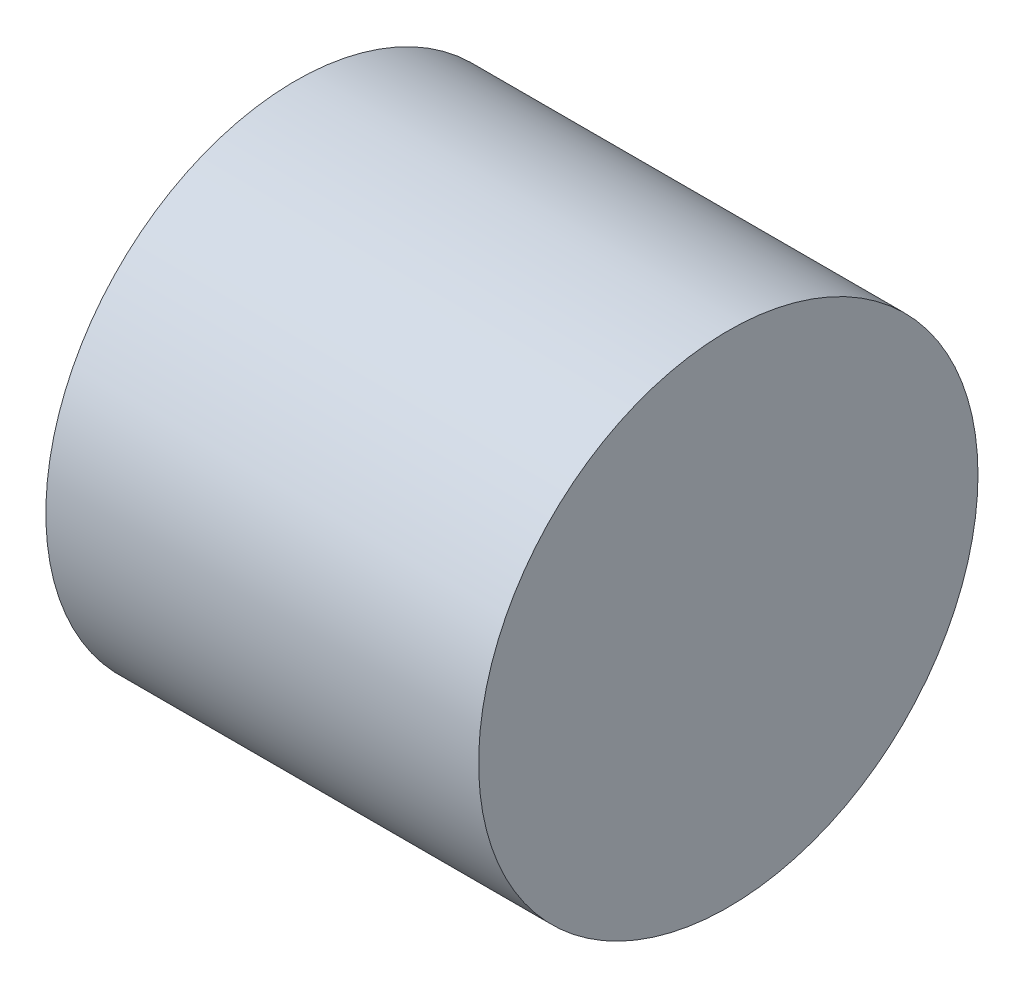
ISO-10303-21;
HEADER;
FILE_DESCRIPTION(('STEP AP214'),'2;1');
FILE_NAME('part.step','',(''),(''),'','','');
FILE_SCHEMA(('AUTOMOTIVE_DESIGN { 1 0 10303 214 1 1 1 1 }'));
ENDSEC;
DATA;
#1=APPLICATION_CONTEXT('core data for automotive mechanical design processes');
#2=APPLICATION_PROTOCOL_DEFINITION('international standard','automotive_design',2000,#1);
#3=PRODUCT_CONTEXT('',#1,'mechanical');
#4=PRODUCT('Part','Part','',(#3));
#5=PRODUCT_RELATED_PRODUCT_CATEGORY('part','',(#4));
#6=PRODUCT_DEFINITION_FORMATION('','',#4);
#7=PRODUCT_DEFINITION_CONTEXT('part definition',#1,'design');
#8=PRODUCT_DEFINITION('design','',#6,#7);
#9=PRODUCT_DEFINITION_SHAPE('','',#8);
#10=(LENGTH_UNIT() NAMED_UNIT(*) SI_UNIT(.MILLI.,.METRE.));
#11=(NAMED_UNIT(*) PLANE_ANGLE_UNIT() SI_UNIT($,.RADIAN.));
#12=(NAMED_UNIT(*) SI_UNIT($,.STERADIAN.) SOLID_ANGLE_UNIT());
#13=UNCERTAINTY_MEASURE_WITH_UNIT(LENGTH_MEASURE(1.E-05),#10,'distance_accuracy_value','');
#14=(GEOMETRIC_REPRESENTATION_CONTEXT(3) GLOBAL_UNCERTAINTY_ASSIGNED_CONTEXT((#13)) GLOBAL_UNIT_ASSIGNED_CONTEXT((#10,
#11,#12)) REPRESENTATION_CONTEXT('',''));
#15=CARTESIAN_POINT('',(0.,0.,0.));
#16=DIRECTION('',(0.,0.,1.));
#17=DIRECTION('',(1.,0.,0.));
#18=AXIS2_PLACEMENT_3D('',#15,#16,#17);
#19=CARTESIAN_POINT('',(10.,21.0123476945098,21.386323928833));
#20=DIRECTION('',(-1.,0.,0.));
#21=DIRECTION('',(0.,0.,1.));
#22=AXIS2_PLACEMENT_3D('',#19,#20,#21);
#23=CYLINDRICAL_SURFACE('',#22,5.7693528958049);
#24=CARTESIAN_POINT('',(10.,21.0123476945098,21.386323928833));
#25=DIRECTION('',(1.,0.,0.));
#26=DIRECTION('',(0.,0.,-1.));
#27=AXIS2_PLACEMENT_3D('',#24,#25,#26);
#28=CIRCLE('',#27,5.7693528958049);
#29=CARTESIAN_POINT('',(10.,21.0123476945098,15.6169710330281));
#30=VERTEX_POINT('',#29);
#31=EDGE_CURVE('E10',#30,#30,#28,.T.);
#32=ORIENTED_EDGE('',*,*,#31,.F.);
#33=EDGE_LOOP('',(#32));
#34=FACE_BOUND('',#33,.T.);
#35=CARTESIAN_POINT('',(0.,21.0123476945098,21.386323928833));
#36=DIRECTION('',(1.,0.,0.));
#37=DIRECTION('',(0.,0.,-1.));
#38=AXIS2_PLACEMENT_3D('',#35,#36,#37);
#39=CIRCLE('',#38,5.7693528958049);
#40=CARTESIAN_POINT('',(0.,21.0123476945098,15.6169710330281));
#41=VERTEX_POINT('',#40);
#42=EDGE_CURVE('E37',#41,#41,#39,.T.);
#43=ORIENTED_EDGE('',*,*,#42,.T.);
#44=EDGE_LOOP('',(#43));
#45=FACE_BOUND('',#44,.T.);
#46=ADVANCED_FACE('F34',(#34,#45),#23,.T.);
#47=CARTESIAN_POINT('',(10.,21.0123476945098,21.386323928833));
#48=DIRECTION('',(1.,0.,0.));
#49=DIRECTION('',(0.,0.,-1.));
#50=AXIS2_PLACEMENT_3D('',#47,#48,#49);
#51=PLANE('',#50);
#52=ORIENTED_EDGE('',*,*,#31,.T.);
#53=EDGE_LOOP('',(#52));
#54=FACE_BOUND('',#53,.T.);
#55=ADVANCED_FACE('F49',(#54),#51,.T.);
#56=CARTESIAN_POINT('',(0.,21.0123476945098,21.386323928833));
#57=DIRECTION('',(1.,0.,0.));
#58=DIRECTION('',(0.,0.,-1.));
#59=AXIS2_PLACEMENT_3D('',#56,#57,#58);
#60=PLANE('',#59);
#61=ORIENTED_EDGE('',*,*,#42,.F.);
#62=EDGE_LOOP('',(#61));
#63=FACE_BOUND('',#62,.T.);
#64=ADVANCED_FACE('F47',(#63),#60,.F.);
#65=CLOSED_SHELL('',(#46,#55,#64));
#66=MANIFOLD_SOLID_BREP('B2',#65);
#67=ADVANCED_BREP_SHAPE_REPRESENTATION('',(#18,#66),#14);
#68=SHAPE_DEFINITION_REPRESENTATION(#9,#67);
ENDSEC;
END-ISO-10303-21;
